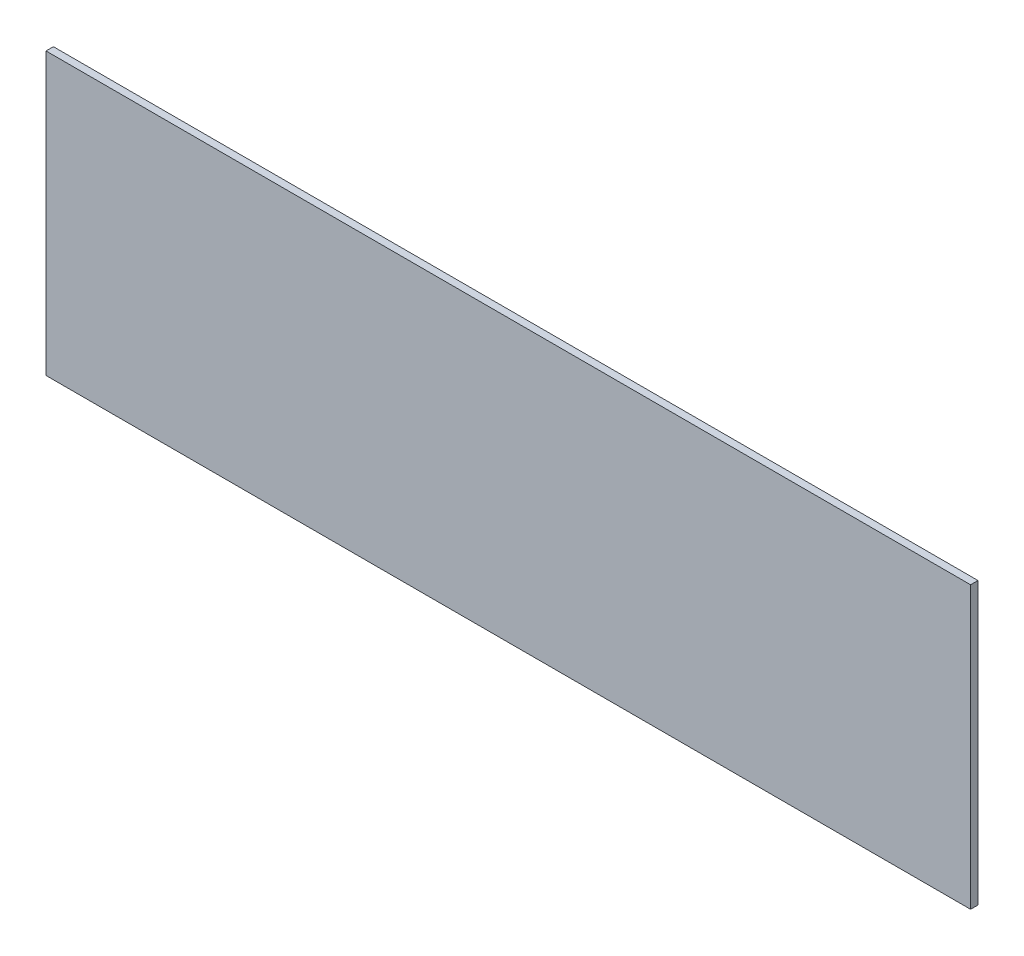
ISO-10303-21;
HEADER;
FILE_DESCRIPTION(('STEP AP214'),'2;1');
FILE_NAME('part.step','',(''),(''),'','','');
FILE_SCHEMA(('AUTOMOTIVE_DESIGN { 1 0 10303 214 1 1 1 1 }'));
ENDSEC;
DATA;
#1=APPLICATION_CONTEXT('core data for automotive mechanical design processes');
#2=APPLICATION_PROTOCOL_DEFINITION('international standard','automotive_design',2000,#1);
#3=PRODUCT_CONTEXT('',#1,'mechanical');
#4=PRODUCT('Part','Part','',(#3));
#5=PRODUCT_RELATED_PRODUCT_CATEGORY('part','',(#4));
#6=PRODUCT_DEFINITION_FORMATION('','',#4);
#7=PRODUCT_DEFINITION_CONTEXT('part definition',#1,'design');
#8=PRODUCT_DEFINITION('design','',#6,#7);
#9=PRODUCT_DEFINITION_SHAPE('','',#8);
#10=(LENGTH_UNIT() NAMED_UNIT(*) SI_UNIT(.MILLI.,.METRE.));
#11=(NAMED_UNIT(*) PLANE_ANGLE_UNIT() SI_UNIT($,.RADIAN.));
#12=(NAMED_UNIT(*) SI_UNIT($,.STERADIAN.) SOLID_ANGLE_UNIT());
#13=UNCERTAINTY_MEASURE_WITH_UNIT(LENGTH_MEASURE(1.E-05),#10,'distance_accuracy_value','');
#14=(GEOMETRIC_REPRESENTATION_CONTEXT(3) GLOBAL_UNCERTAINTY_ASSIGNED_CONTEXT((#13)) GLOBAL_UNIT_ASSIGNED_CONTEXT((#10,
#11,#12)) REPRESENTATION_CONTEXT('',''));
#15=CARTESIAN_POINT('',(0.,0.,0.));
#16=DIRECTION('',(0.,0.,1.));
#17=DIRECTION('',(1.,0.,0.));
#18=AXIS2_PLACEMENT_3D('',#15,#16,#17);
#19=CARTESIAN_POINT('',(0.,0.,1.));
#20=DIRECTION('',(1.,0.,0.));
#21=DIRECTION('',(0.,0.,-1.));
#22=AXIS2_PLACEMENT_3D('',#19,#20,#21);
#23=PLANE('',#22);
#24=DIRECTION('',(0.,-1.,0.));
#25=VECTOR('',#24,1.);
#26=CARTESIAN_POINT('',(0.,0.,0.));
#27=LINE('',#26,#25);
#28=CARTESIAN_POINT('',(0.,38.,0.));
#29=VERTEX_POINT('',#28);
#30=CARTESIAN_POINT('',(0.,0.,0.));
#31=VERTEX_POINT('',#30);
#32=EDGE_CURVE('E108',#29,#31,#27,.T.);
#33=ORIENTED_EDGE('',*,*,#32,.T.);
#34=DIRECTION('',(0.,0.,-1.));
#35=VECTOR('',#34,1.);
#36=CARTESIAN_POINT('',(0.,0.,1.));
#37=LINE('',#36,#35);
#38=CARTESIAN_POINT('',(0.,0.,1.));
#39=VERTEX_POINT('',#38);
#40=EDGE_CURVE('E11',#39,#31,#37,.T.);
#41=ORIENTED_EDGE('',*,*,#40,.F.);
#42=DIRECTION('',(0.,-1.,0.));
#43=VECTOR('',#42,1.);
#44=CARTESIAN_POINT('',(0.,0.,1.));
#45=LINE('',#44,#43);
#46=CARTESIAN_POINT('',(0.,38.,1.));
#47=VERTEX_POINT('',#46);
#48=EDGE_CURVE('E92',#47,#39,#45,.T.);
#49=ORIENTED_EDGE('',*,*,#48,.F.);
#50=DIRECTION('',(0.,0.,-1.));
#51=VECTOR('',#50,1.);
#52=CARTESIAN_POINT('',(0.,38.,1.));
#53=LINE('',#52,#51);
#54=EDGE_CURVE('E105',#47,#29,#53,.T.);
#55=ORIENTED_EDGE('',*,*,#54,.T.);
#56=EDGE_LOOP('',(#33,#41,#49,#55));
#57=FACE_BOUND('',#56,.T.);
#58=ADVANCED_FACE('F43',(#57),#23,.F.);
#59=CARTESIAN_POINT('',(0.,0.,1.));
#60=DIRECTION('',(0.,1.,0.));
#61=DIRECTION('',(0.,0.,1.));
#62=AXIS2_PLACEMENT_3D('',#59,#60,#61);
#63=PLANE('',#62);
#64=DIRECTION('',(1.,0.,0.));
#65=VECTOR('',#64,1.);
#66=CARTESIAN_POINT('',(0.,0.,0.));
#67=LINE('',#66,#65);
#68=CARTESIAN_POINT('',(125.,0.,0.));
#69=VERTEX_POINT('',#68);
#70=EDGE_CURVE('E97',#31,#69,#67,.T.);
#71=ORIENTED_EDGE('',*,*,#70,.T.);
#72=DIRECTION('',(0.,0.,-1.));
#73=VECTOR('',#72,1.);
#74=CARTESIAN_POINT('',(125.,0.,1.));
#75=LINE('',#74,#73);
#76=CARTESIAN_POINT('',(125.,0.,1.));
#77=VERTEX_POINT('',#76);
#78=EDGE_CURVE('E51',#77,#69,#75,.T.);
#79=ORIENTED_EDGE('',*,*,#78,.F.);
#80=DIRECTION('',(1.,0.,0.));
#81=VECTOR('',#80,1.);
#82=CARTESIAN_POINT('',(0.,0.,1.));
#83=LINE('',#82,#81);
#84=EDGE_CURVE('E87',#39,#77,#83,.T.);
#85=ORIENTED_EDGE('',*,*,#84,.F.);
#86=ORIENTED_EDGE('',*,*,#40,.T.);
#87=EDGE_LOOP('',(#71,#79,#85,#86));
#88=FACE_BOUND('',#87,.T.);
#89=ADVANCED_FACE('F100',(#88),#63,.F.);
#90=CARTESIAN_POINT('',(125.,0.,1.));
#91=DIRECTION('',(-1.,0.,0.));
#92=DIRECTION('',(0.,0.,1.));
#93=AXIS2_PLACEMENT_3D('',#90,#91,#92);
#94=PLANE('',#93);
#95=DIRECTION('',(0.,1.,0.));
#96=VECTOR('',#95,1.);
#97=CARTESIAN_POINT('',(125.,0.,0.));
#98=LINE('',#97,#96);
#99=CARTESIAN_POINT('',(125.,38.,0.));
#100=VERTEX_POINT('',#99);
#101=EDGE_CURVE('E78',#69,#100,#98,.T.);
#102=ORIENTED_EDGE('',*,*,#101,.T.);
#103=DIRECTION('',(0.,0.,-1.));
#104=VECTOR('',#103,1.);
#105=CARTESIAN_POINT('',(125.,38.,1.));
#106=LINE('',#105,#104);
#107=CARTESIAN_POINT('',(125.,38.,1.));
#108=VERTEX_POINT('',#107);
#109=EDGE_CURVE('E98',#108,#100,#106,.T.);
#110=ORIENTED_EDGE('',*,*,#109,.F.);
#111=DIRECTION('',(0.,1.,0.));
#112=VECTOR('',#111,1.);
#113=CARTESIAN_POINT('',(125.,0.,1.));
#114=LINE('',#113,#112);
#115=EDGE_CURVE('E95',#77,#108,#114,.T.);
#116=ORIENTED_EDGE('',*,*,#115,.F.);
#117=ORIENTED_EDGE('',*,*,#78,.T.);
#118=EDGE_LOOP('',(#102,#110,#116,#117));
#119=FACE_BOUND('',#118,.T.);
#120=ADVANCED_FACE('F99',(#119),#94,.F.);
#121=CARTESIAN_POINT('',(0.,38.,1.));
#122=DIRECTION('',(0.,-1.,0.));
#123=DIRECTION('',(0.,0.,-1.));
#124=AXIS2_PLACEMENT_3D('',#121,#122,#123);
#125=PLANE('',#124);
#126=DIRECTION('',(-1.,0.,0.));
#127=VECTOR('',#126,1.);
#128=CARTESIAN_POINT('',(0.,38.,0.));
#129=LINE('',#128,#127);
#130=EDGE_CURVE('E85',#100,#29,#129,.T.);
#131=ORIENTED_EDGE('',*,*,#130,.T.);
#132=ORIENTED_EDGE('',*,*,#54,.F.);
#133=DIRECTION('',(-1.,0.,0.));
#134=VECTOR('',#133,1.);
#135=CARTESIAN_POINT('',(0.,38.,1.));
#136=LINE('',#135,#134);
#137=EDGE_CURVE('E56',#108,#47,#136,.T.);
#138=ORIENTED_EDGE('',*,*,#137,.F.);
#139=ORIENTED_EDGE('',*,*,#109,.T.);
#140=EDGE_LOOP('',(#131,#132,#138,#139));
#141=FACE_BOUND('',#140,.T.);
#142=ADVANCED_FACE('F111',(#141),#125,.F.);
#143=CARTESIAN_POINT('',(0.,0.,1.));
#144=DIRECTION('',(0.,0.,-1.));
#145=DIRECTION('',(-1.,0.,0.));
#146=AXIS2_PLACEMENT_3D('',#143,#144,#145);
#147=PLANE('',#146);
#148=ORIENTED_EDGE('',*,*,#48,.T.);
#149=ORIENTED_EDGE('',*,*,#84,.T.);
#150=ORIENTED_EDGE('',*,*,#115,.T.);
#151=ORIENTED_EDGE('',*,*,#137,.T.);
#152=EDGE_LOOP('',(#148,#149,#150,#151));
#153=FACE_BOUND('',#152,.T.);
#154=ADVANCED_FACE('F89',(#153),#147,.F.);
#155=CARTESIAN_POINT('',(0.,0.,0.));
#156=DIRECTION('',(0.,0.,-1.));
#157=DIRECTION('',(-1.,0.,0.));
#158=AXIS2_PLACEMENT_3D('',#155,#156,#157);
#159=PLANE('',#158);
#160=ORIENTED_EDGE('',*,*,#32,.F.);
#161=ORIENTED_EDGE('',*,*,#130,.F.);
#162=ORIENTED_EDGE('',*,*,#101,.F.);
#163=ORIENTED_EDGE('',*,*,#70,.F.);
#164=EDGE_LOOP('',(#160,#161,#162,#163));
#165=FACE_BOUND('',#164,.T.);
#166=ADVANCED_FACE('F118',(#165),#159,.T.);
#167=CLOSED_SHELL('',(#58,#89,#120,#142,#154,#166));
#168=MANIFOLD_SOLID_BREP('B2',#167);
#169=ADVANCED_BREP_SHAPE_REPRESENTATION('',(#18,#168),#14);
#170=SHAPE_DEFINITION_REPRESENTATION(#9,#169);
ENDSEC;
END-ISO-10303-21;
